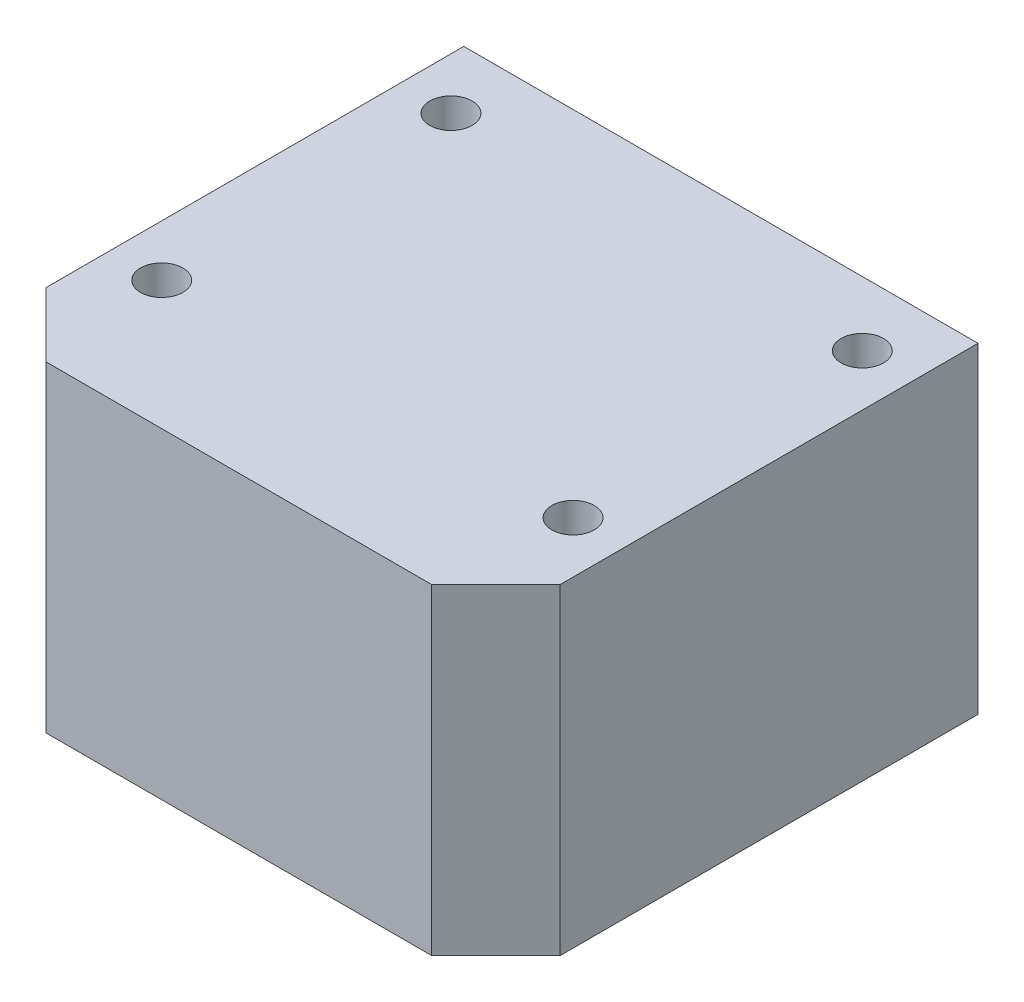
ISO-10303-21;
HEADER;
FILE_DESCRIPTION(('STEP AP214'),'2;1');
FILE_NAME('part.step','',(''),(''),'','','');
FILE_SCHEMA(('AUTOMOTIVE_DESIGN { 1 0 10303 214 1 1 1 1 }'));
ENDSEC;
DATA;
#1=APPLICATION_CONTEXT('core data for automotive mechanical design processes');
#2=APPLICATION_PROTOCOL_DEFINITION('international standard','automotive_design',2000,#1);
#3=PRODUCT_CONTEXT('',#1,'mechanical');
#4=PRODUCT('Part','Part','',(#3));
#5=PRODUCT_RELATED_PRODUCT_CATEGORY('part','',(#4));
#6=PRODUCT_DEFINITION_FORMATION('','',#4);
#7=PRODUCT_DEFINITION_CONTEXT('part definition',#1,'design');
#8=PRODUCT_DEFINITION('design','',#6,#7);
#9=PRODUCT_DEFINITION_SHAPE('','',#8);
#10=(LENGTH_UNIT() NAMED_UNIT(*) SI_UNIT(.MILLI.,.METRE.));
#11=(NAMED_UNIT(*) PLANE_ANGLE_UNIT() SI_UNIT($,.RADIAN.));
#12=(NAMED_UNIT(*) SI_UNIT($,.STERADIAN.) SOLID_ANGLE_UNIT());
#13=UNCERTAINTY_MEASURE_WITH_UNIT(LENGTH_MEASURE(1.E-05),#10,'distance_accuracy_value','');
#14=(GEOMETRIC_REPRESENTATION_CONTEXT(3) GLOBAL_UNCERTAINTY_ASSIGNED_CONTEXT((#13)) GLOBAL_UNIT_ASSIGNED_CONTEXT((#10,
#11,#12)) REPRESENTATION_CONTEXT('',''));
#15=CARTESIAN_POINT('',(0.,0.,0.));
#16=DIRECTION('',(0.,0.,1.));
#17=DIRECTION('',(1.,0.,0.));
#18=AXIS2_PLACEMENT_3D('',#15,#16,#17);
#19=CARTESIAN_POINT('',(-20.,25.,12.5));
#20=DIRECTION('',(1.,0.,0.));
#21=DIRECTION('',(0.,0.,-1.));
#22=AXIS2_PLACEMENT_3D('',#19,#20,#21);
#23=PLANE('',#22);
#24=DIRECTION('',(0.,0.,1.));
#25=VECTOR('',#24,1.);
#26=CARTESIAN_POINT('',(-20.,0.,12.5));
#27=LINE('',#26,#25);
#28=CARTESIAN_POINT('',(-20.,0.,-20.));
#29=VERTEX_POINT('',#28);
#30=CARTESIAN_POINT('',(-20.,0.,12.5));
#31=VERTEX_POINT('',#30);
#32=EDGE_CURVE('E180',#29,#31,#27,.T.);
#33=ORIENTED_EDGE('',*,*,#32,.T.);
#34=DIRECTION('',(0.,1.,0.));
#35=VECTOR('',#34,1.);
#36=CARTESIAN_POINT('',(-20.,25.,12.5));
#37=LINE('',#36,#35);
#38=CARTESIAN_POINT('',(-20.,25.,12.5));
#39=VERTEX_POINT('',#38);
#40=EDGE_CURVE('E11',#31,#39,#37,.T.);
#41=ORIENTED_EDGE('',*,*,#40,.T.);
#42=DIRECTION('',(0.,0.,1.));
#43=VECTOR('',#42,1.);
#44=CARTESIAN_POINT('',(-20.,25.,12.5));
#45=LINE('',#44,#43);
#46=CARTESIAN_POINT('',(-20.,25.,-20.));
#47=VERTEX_POINT('',#46);
#48=EDGE_CURVE('E181',#47,#39,#45,.T.);
#49=ORIENTED_EDGE('',*,*,#48,.F.);
#50=DIRECTION('',(0.,-1.,0.));
#51=VECTOR('',#50,1.);
#52=CARTESIAN_POINT('',(-20.,25.,-20.));
#53=LINE('',#52,#51);
#54=EDGE_CURVE('E191',#47,#29,#53,.T.);
#55=ORIENTED_EDGE('',*,*,#54,.T.);
#56=EDGE_LOOP('',(#33,#41,#49,#55));
#57=FACE_BOUND('',#56,.T.);
#58=ADVANCED_FACE('F51',(#57),#23,.F.);
#59=CARTESIAN_POINT('',(20.,25.,12.5));
#60=DIRECTION('',(-1.,0.,0.));
#61=DIRECTION('',(0.,0.,1.));
#62=AXIS2_PLACEMENT_3D('',#59,#60,#61);
#63=PLANE('',#62);
#64=DIRECTION('',(0.,0.,-1.));
#65=VECTOR('',#64,1.);
#66=CARTESIAN_POINT('',(20.,25.,12.5));
#67=LINE('',#66,#65);
#68=CARTESIAN_POINT('',(20.,25.,12.5));
#69=VERTEX_POINT('',#68);
#70=CARTESIAN_POINT('',(20.,25.,-20.));
#71=VERTEX_POINT('',#70);
#72=EDGE_CURVE('E184',#69,#71,#67,.T.);
#73=ORIENTED_EDGE('',*,*,#72,.F.);
#74=DIRECTION('',(0.,-1.,0.));
#75=VECTOR('',#74,1.);
#76=CARTESIAN_POINT('',(20.,0.,12.5));
#77=LINE('',#76,#75);
#78=CARTESIAN_POINT('',(20.,0.,12.5));
#79=VERTEX_POINT('',#78);
#80=EDGE_CURVE('E214',#69,#79,#77,.T.);
#81=ORIENTED_EDGE('',*,*,#80,.T.);
#82=DIRECTION('',(0.,0.,-1.));
#83=VECTOR('',#82,1.);
#84=CARTESIAN_POINT('',(20.,0.,12.5));
#85=LINE('',#84,#83);
#86=CARTESIAN_POINT('',(20.,0.,-20.));
#87=VERTEX_POINT('',#86);
#88=EDGE_CURVE('E194',#79,#87,#85,.T.);
#89=ORIENTED_EDGE('',*,*,#88,.T.);
#90=DIRECTION('',(0.,-1.,0.));
#91=VECTOR('',#90,1.);
#92=CARTESIAN_POINT('',(20.,25.,-20.));
#93=LINE('',#92,#91);
#94=EDGE_CURVE('E202',#71,#87,#93,.T.);
#95=ORIENTED_EDGE('',*,*,#94,.F.);
#96=EDGE_LOOP('',(#73,#81,#89,#95));
#97=FACE_BOUND('',#96,.T.);
#98=ADVANCED_FACE('F241',(#97),#63,.F.);
#99=CARTESIAN_POINT('',(20.,25.,-20.));
#100=DIRECTION('',(0.,0.,1.));
#101=DIRECTION('',(1.,0.,0.));
#102=AXIS2_PLACEMENT_3D('',#99,#100,#101);
#103=PLANE('',#102);
#104=CARTESIAN_POINT('',(0.,17.,-20.));
#105=DIRECTION('',(0.,0.,-1.));
#106=DIRECTION('',(-1.,0.,0.));
#107=AXIS2_PLACEMENT_3D('',#104,#105,#106);
#108=CIRCLE('',#107,1.64999999999999);
#109=CARTESIAN_POINT('',(-1.64999999999999,17.,-20.));
#110=VERTEX_POINT('',#109);
#111=EDGE_CURVE('E161',#110,#110,#108,.T.);
#112=ORIENTED_EDGE('',*,*,#111,.F.);
#113=EDGE_LOOP('',(#112));
#114=FACE_BOUND('',#113,.T.);
#115=DIRECTION('',(-1.,0.,0.));
#116=VECTOR('',#115,1.);
#117=CARTESIAN_POINT('',(20.,0.,-20.));
#118=LINE('',#117,#116);
#119=EDGE_CURVE('E185',#87,#29,#118,.T.);
#120=ORIENTED_EDGE('',*,*,#119,.T.);
#121=ORIENTED_EDGE('',*,*,#54,.F.);
#122=DIRECTION('',(-1.,0.,0.));
#123=VECTOR('',#122,1.);
#124=CARTESIAN_POINT('',(20.,25.,-20.));
#125=LINE('',#124,#123);
#126=EDGE_CURVE('E188',#71,#47,#125,.T.);
#127=ORIENTED_EDGE('',*,*,#126,.F.);
#128=ORIENTED_EDGE('',*,*,#94,.T.);
#129=EDGE_LOOP('',(#120,#121,#127,#128));
#130=FACE_BOUND('',#129,.T.);
#131=ADVANCED_FACE('F256',(#114,#130),#103,.F.);
#132=CARTESIAN_POINT('',(0.,25.,0.));
#133=DIRECTION('',(0.,1.,0.));
#134=DIRECTION('',(0.,0.,1.));
#135=AXIS2_PLACEMENT_3D('',#132,#133,#134);
#136=PLANE('',#135);
#137=CARTESIAN_POINT('',(-16.,25.,-15.));
#138=DIRECTION('',(0.,1.,0.));
#139=DIRECTION('',(0.,0.,1.));
#140=AXIS2_PLACEMENT_3D('',#137,#138,#139);
#141=CIRCLE('',#140,1.64999999999999);
#142=CARTESIAN_POINT('',(-16.,25.,-13.35));
#143=VERTEX_POINT('',#142);
#144=EDGE_CURVE('E132',#143,#143,#141,.T.);
#145=ORIENTED_EDGE('',*,*,#144,.F.);
#146=EDGE_LOOP('',(#145));
#147=FACE_BOUND('',#146,.T.);
#148=CARTESIAN_POINT('',(-16.,25.,7.5));
#149=DIRECTION('',(0.,1.,0.));
#150=DIRECTION('',(0.,0.,1.));
#151=AXIS2_PLACEMENT_3D('',#148,#149,#150);
#152=CIRCLE('',#151,1.64999999999999);
#153=CARTESIAN_POINT('',(-16.,25.,9.14999999999999));
#154=VERTEX_POINT('',#153);
#155=EDGE_CURVE('E131',#154,#154,#152,.T.);
#156=ORIENTED_EDGE('',*,*,#155,.F.);
#157=EDGE_LOOP('',(#156));
#158=FACE_BOUND('',#157,.T.);
#159=CARTESIAN_POINT('',(16.,25.,7.5));
#160=DIRECTION('',(0.,1.,0.));
#161=DIRECTION('',(0.,0.,1.));
#162=AXIS2_PLACEMENT_3D('',#159,#160,#161);
#163=CIRCLE('',#162,1.64999999999999);
#164=CARTESIAN_POINT('',(16.,25.,9.14999999999999));
#165=VERTEX_POINT('',#164);
#166=EDGE_CURVE('E145',#165,#165,#163,.T.);
#167=ORIENTED_EDGE('',*,*,#166,.F.);
#168=EDGE_LOOP('',(#167));
#169=FACE_BOUND('',#168,.T.);
#170=CARTESIAN_POINT('',(16.,25.,-15.));
#171=DIRECTION('',(0.,1.,0.));
#172=DIRECTION('',(0.,0.,1.));
#173=AXIS2_PLACEMENT_3D('',#170,#171,#172);
#174=CIRCLE('',#173,1.64999999999999);
#175=CARTESIAN_POINT('',(16.,25.,-13.35));
#176=VERTEX_POINT('',#175);
#177=EDGE_CURVE('E153',#176,#176,#174,.T.);
#178=ORIENTED_EDGE('',*,*,#177,.F.);
#179=EDGE_LOOP('',(#178));
#180=FACE_BOUND('',#179,.T.);
#181=DIRECTION('',(-1.,0.,0.));
#182=VECTOR('',#181,1.);
#183=CARTESIAN_POINT('',(-20.,25.,17.5));
#184=LINE('',#183,#182);
#185=CARTESIAN_POINT('',(15.,25.,17.5));
#186=VERTEX_POINT('',#185);
#187=CARTESIAN_POINT('',(-15.,25.,17.5));
#188=VERTEX_POINT('',#187);
#189=EDGE_CURVE('E177',#186,#188,#184,.T.);
#190=ORIENTED_EDGE('',*,*,#189,.F.);
#191=DIRECTION('',(0.707106781186549,0.,-0.707106781186547));
#192=VECTOR('',#191,1.);
#193=CARTESIAN_POINT('',(16.25,25.,16.25));
#194=LINE('',#193,#192);
#195=EDGE_CURVE('E61',#186,#69,#194,.T.);
#196=ORIENTED_EDGE('',*,*,#195,.T.);
#197=ORIENTED_EDGE('',*,*,#72,.T.);
#198=ORIENTED_EDGE('',*,*,#126,.T.);
#199=ORIENTED_EDGE('',*,*,#48,.T.);
#200=DIRECTION('',(0.707106781186546,0.,0.707106781186549));
#201=VECTOR('',#200,1.);
#202=CARTESIAN_POINT('',(-16.25,25.,16.25));
#203=LINE('',#202,#201);
#204=EDGE_CURVE('E73',#39,#188,#203,.T.);
#205=ORIENTED_EDGE('',*,*,#204,.T.);
#206=EDGE_LOOP('',(#190,#196,#197,#198,#199,#205));
#207=FACE_BOUND('',#206,.T.);
#208=ADVANCED_FACE('F235',(#147,#158,#169,#180,#207),#136,.T.);
#209=CARTESIAN_POINT('',(0.,0.,0.));
#210=DIRECTION('',(0.,1.,0.));
#211=DIRECTION('',(0.,0.,1.));
#212=AXIS2_PLACEMENT_3D('',#209,#210,#211);
#213=PLANE('',#212);
#214=CARTESIAN_POINT('',(0.,0.,0.));
#215=DIRECTION('',(0.,1.,0.));
#216=DIRECTION('',(0.,0.,1.));
#217=AXIS2_PLACEMENT_3D('',#214,#215,#216);
#218=CIRCLE('',#217,15.);
#219=CARTESIAN_POINT('',(0.,0.,15.));
#220=VERTEX_POINT('',#219);
#221=EDGE_CURVE('E206',#220,#220,#218,.T.);
#222=ORIENTED_EDGE('',*,*,#221,.T.);
#223=EDGE_LOOP('',(#222));
#224=FACE_BOUND('',#223,.T.);
#225=ORIENTED_EDGE('',*,*,#88,.F.);
#226=DIRECTION('',(-0.707106781186549,0.,0.707106781186547));
#227=VECTOR('',#226,1.);
#228=CARTESIAN_POINT('',(20.,0.,12.5));
#229=LINE('',#228,#227);
#230=CARTESIAN_POINT('',(15.,0.,17.5));
#231=VERTEX_POINT('',#230);
#232=EDGE_CURVE('E221',#79,#231,#229,.T.);
#233=ORIENTED_EDGE('',*,*,#232,.T.);
#234=DIRECTION('',(-1.,0.,0.));
#235=VECTOR('',#234,1.);
#236=CARTESIAN_POINT('',(-20.,0.,17.5));
#237=LINE('',#236,#235);
#238=CARTESIAN_POINT('',(-15.,0.,17.5));
#239=VERTEX_POINT('',#238);
#240=EDGE_CURVE('E173',#231,#239,#237,.T.);
#241=ORIENTED_EDGE('',*,*,#240,.T.);
#242=DIRECTION('',(-0.707106781186546,0.,-0.707106781186549));
#243=VECTOR('',#242,1.);
#244=CARTESIAN_POINT('',(-15.,0.,17.5));
#245=LINE('',#244,#243);
#246=EDGE_CURVE('E218',#239,#31,#245,.T.);
#247=ORIENTED_EDGE('',*,*,#246,.T.);
#248=ORIENTED_EDGE('',*,*,#32,.F.);
#249=ORIENTED_EDGE('',*,*,#119,.F.);
#250=EDGE_LOOP('',(#225,#233,#241,#247,#248,#249));
#251=FACE_BOUND('',#250,.T.);
#252=ADVANCED_FACE('F247',(#224,#251),#213,.F.);
#253=CARTESIAN_POINT('',(-20.,65.3112887414927,17.5));
#254=DIRECTION('',(0.,0.,1.));
#255=DIRECTION('',(1.,0.,0.));
#256=AXIS2_PLACEMENT_3D('',#253,#254,#255);
#257=PLANE('',#256);
#258=ORIENTED_EDGE('',*,*,#240,.F.);
#259=DIRECTION('',(0.,1.,0.));
#260=VECTOR('',#259,1.);
#261=CARTESIAN_POINT('',(15.,25.,17.5));
#262=LINE('',#261,#260);
#263=EDGE_CURVE('E228',#231,#186,#262,.T.);
#264=ORIENTED_EDGE('',*,*,#263,.T.);
#265=ORIENTED_EDGE('',*,*,#189,.T.);
#266=DIRECTION('',(0.,-1.,0.));
#267=VECTOR('',#266,1.);
#268=CARTESIAN_POINT('',(-15.,0.,17.5));
#269=LINE('',#268,#267);
#270=EDGE_CURVE('E224',#188,#239,#269,.T.);
#271=ORIENTED_EDGE('',*,*,#270,.T.);
#272=EDGE_LOOP('',(#258,#264,#265,#271));
#273=FACE_BOUND('',#272,.T.);
#274=ADVANCED_FACE('F250',(#273),#257,.T.);
#275=CARTESIAN_POINT('',(0.,9.,0.));
#276=DIRECTION('',(0.,-1.,0.));
#277=DIRECTION('',(0.,0.,-1.));
#278=AXIS2_PLACEMENT_3D('',#275,#276,#277);
#279=CYLINDRICAL_SURFACE('',#278,14.);
#280=CARTESIAN_POINT('',(0.,1.00000000000001,0.));
#281=DIRECTION('',(0.,1.,0.));
#282=DIRECTION('',(0.,0.,1.));
#283=AXIS2_PLACEMENT_3D('',#280,#281,#282);
#284=CIRCLE('',#283,14.);
#285=CARTESIAN_POINT('',(0.,1.00000000000001,14.));
#286=VERTEX_POINT('',#285);
#287=EDGE_CURVE('E210',#286,#286,#284,.F.);
#288=ORIENTED_EDGE('',*,*,#287,.T.);
#289=EDGE_LOOP('',(#288));
#290=FACE_BOUND('',#289,.T.);
#291=CARTESIAN_POINT('',(0.,9.,0.));
#292=DIRECTION('',(0.,1.,0.));
#293=DIRECTION('',(0.,0.,1.));
#294=AXIS2_PLACEMENT_3D('',#291,#292,#293);
#295=CIRCLE('',#294,14.);
#296=CARTESIAN_POINT('',(0.,9.,14.));
#297=VERTEX_POINT('',#296);
#298=EDGE_CURVE('E169',#297,#297,#295,.T.);
#299=ORIENTED_EDGE('',*,*,#298,.T.);
#300=EDGE_LOOP('',(#299));
#301=FACE_BOUND('',#300,.T.);
#302=ADVANCED_FACE('F306',(#290,#301),#279,.F.);
#303=CARTESIAN_POINT('',(0.,9.,0.));
#304=DIRECTION('',(0.,1.,0.));
#305=DIRECTION('',(0.,0.,1.));
#306=AXIS2_PLACEMENT_3D('',#303,#304,#305);
#307=PLANE('',#306);
#308=ORIENTED_EDGE('',*,*,#298,.F.);
#309=EDGE_LOOP('',(#308));
#310=FACE_BOUND('',#309,.T.);
#311=ADVANCED_FACE('F281',(#310),#307,.F.);
#312=CARTESIAN_POINT('',(0.,0.,0.));
#313=DIRECTION('',(0.,-1.,0.));
#314=DIRECTION('',(0.,0.,-1.));
#315=AXIS2_PLACEMENT_3D('',#312,#313,#314);
#316=CONICAL_SURFACE('',#315,15.,0.78539816339745);
#317=ORIENTED_EDGE('',*,*,#287,.F.);
#318=EDGE_LOOP('',(#317));
#319=FACE_BOUND('',#318,.T.);
#320=ORIENTED_EDGE('',*,*,#221,.F.);
#321=EDGE_LOOP('',(#320));
#322=FACE_BOUND('',#321,.T.);
#323=ADVANCED_FACE('F275',(#319,#322),#316,.F.);
#324=CARTESIAN_POINT('',(0.,17.,-10.));
#325=DIRECTION('',(0.,0.,-1.));
#326=DIRECTION('',(-1.,0.,0.));
#327=AXIS2_PLACEMENT_3D('',#324,#325,#326);
#328=CONICAL_SURFACE('',#327,1.65,1.02974425867665);
#329=CARTESIAN_POINT('',(0.,17.,-9.00857997860453));
#330=VERTEX_POINT('',#329);
#331=VERTEX_LOOP('',#330);
#332=FACE_BOUND('',#331,.T.);
#333=CARTESIAN_POINT('',(0.,17.,-10.));
#334=DIRECTION('',(0.,0.,-1.));
#335=DIRECTION('',(-1.,0.,0.));
#336=AXIS2_PLACEMENT_3D('',#333,#334,#335);
#337=CIRCLE('',#336,1.65);
#338=CARTESIAN_POINT('',(-1.65,17.,-10.));
#339=VERTEX_POINT('',#338);
#340=EDGE_CURVE('E165',#339,#339,#337,.T.);
#341=ORIENTED_EDGE('',*,*,#340,.T.);
#342=EDGE_LOOP('',(#341));
#343=FACE_BOUND('',#342,.T.);
#344=ADVANCED_FACE('F280',(#332,#343),#328,.F.);
#345=CARTESIAN_POINT('',(0.,17.,-20.));
#346=DIRECTION('',(0.,0.,-1.));
#347=DIRECTION('',(-1.,0.,0.));
#348=AXIS2_PLACEMENT_3D('',#345,#346,#347);
#349=CYLINDRICAL_SURFACE('',#348,1.64999999999999);
#350=ORIENTED_EDGE('',*,*,#340,.F.);
#351=EDGE_LOOP('',(#350));
#352=FACE_BOUND('',#351,.T.);
#353=ORIENTED_EDGE('',*,*,#111,.T.);
#354=EDGE_LOOP('',(#353));
#355=FACE_BOUND('',#354,.T.);
#356=ADVANCED_FACE('F286',(#352,#355),#349,.F.);
#357=CARTESIAN_POINT('',(20.,25.,12.5));
#358=DIRECTION('',(0.707106781186546,0.,0.707106781186548));
#359=DIRECTION('',(0.,1.,0.));
#360=AXIS2_PLACEMENT_3D('',#357,#358,#359);
#361=PLANE('',#360);
#362=ORIENTED_EDGE('',*,*,#195,.F.);
#363=ORIENTED_EDGE('',*,*,#263,.F.);
#364=ORIENTED_EDGE('',*,*,#232,.F.);
#365=ORIENTED_EDGE('',*,*,#80,.F.);
#366=EDGE_LOOP('',(#362,#363,#364,#365));
#367=FACE_BOUND('',#366,.T.);
#368=ADVANCED_FACE('F244',(#367),#361,.T.);
#369=CARTESIAN_POINT('',(-15.,65.3112887414927,17.5));
#370=DIRECTION('',(-0.707106781186549,0.,0.707106781186546));
#371=DIRECTION('',(0.,1.,0.));
#372=AXIS2_PLACEMENT_3D('',#369,#370,#371);
#373=PLANE('',#372);
#374=ORIENTED_EDGE('',*,*,#204,.F.);
#375=ORIENTED_EDGE('',*,*,#40,.F.);
#376=ORIENTED_EDGE('',*,*,#246,.F.);
#377=ORIENTED_EDGE('',*,*,#270,.F.);
#378=EDGE_LOOP('',(#374,#375,#376,#377));
#379=FACE_BOUND('',#378,.T.);
#380=ADVANCED_FACE('F54',(#379),#373,.T.);
#381=CARTESIAN_POINT('',(16.,12.9,-15.));
#382=DIRECTION('',(0.,1.,0.));
#383=DIRECTION('',(0.,0.,1.));
#384=AXIS2_PLACEMENT_3D('',#381,#382,#383);
#385=CONICAL_SURFACE('',#384,1.65,1.02974425867665);
#386=CARTESIAN_POINT('',(16.,11.9085799786045,-15.));
#387=VERTEX_POINT('',#386);
#388=VERTEX_LOOP('',#387);
#389=FACE_BOUND('',#388,.T.);
#390=CARTESIAN_POINT('',(16.,12.9,-15.));
#391=DIRECTION('',(0.,1.,0.));
#392=DIRECTION('',(0.,0.,1.));
#393=AXIS2_PLACEMENT_3D('',#390,#391,#392);
#394=CIRCLE('',#393,1.65);
#395=CARTESIAN_POINT('',(16.,12.9,-13.35));
#396=VERTEX_POINT('',#395);
#397=EDGE_CURVE('E157',#396,#396,#394,.T.);
#398=ORIENTED_EDGE('',*,*,#397,.T.);
#399=EDGE_LOOP('',(#398));
#400=FACE_BOUND('',#399,.T.);
#401=ADVANCED_FACE('F291',(#389,#400),#385,.F.);
#402=CARTESIAN_POINT('',(16.,25.,-15.));
#403=DIRECTION('',(0.,1.,0.));
#404=DIRECTION('',(0.,0.,1.));
#405=AXIS2_PLACEMENT_3D('',#402,#403,#404);
#406=CYLINDRICAL_SURFACE('',#405,1.65);
#407=ORIENTED_EDGE('',*,*,#397,.F.);
#408=EDGE_LOOP('',(#407));
#409=FACE_BOUND('',#408,.T.);
#410=ORIENTED_EDGE('',*,*,#177,.T.);
#411=EDGE_LOOP('',(#410));
#412=FACE_BOUND('',#411,.T.);
#413=ADVANCED_FACE('F425',(#409,#412),#406,.F.);
#414=CARTESIAN_POINT('',(16.,12.9,7.5));
#415=DIRECTION('',(0.,1.,0.));
#416=DIRECTION('',(0.,0.,1.));
#417=AXIS2_PLACEMENT_3D('',#414,#415,#416);
#418=CONICAL_SURFACE('',#417,1.65,1.02974425867665);
#419=CARTESIAN_POINT('',(16.,11.9085799786045,7.5));
#420=VERTEX_POINT('',#419);
#421=VERTEX_LOOP('',#420);
#422=FACE_BOUND('',#421,.T.);
#423=CARTESIAN_POINT('',(16.,12.9,7.5));
#424=DIRECTION('',(0.,1.,0.));
#425=DIRECTION('',(0.,0.,1.));
#426=AXIS2_PLACEMENT_3D('',#423,#424,#425);
#427=CIRCLE('',#426,1.65);
#428=CARTESIAN_POINT('',(16.,12.9,9.15));
#429=VERTEX_POINT('',#428);
#430=EDGE_CURVE('E149',#429,#429,#427,.T.);
#431=ORIENTED_EDGE('',*,*,#430,.T.);
#432=EDGE_LOOP('',(#431));
#433=FACE_BOUND('',#432,.T.);
#434=ADVANCED_FACE('F433',(#422,#433),#418,.F.);
#435=CARTESIAN_POINT('',(16.,25.,7.5));
#436=DIRECTION('',(0.,1.,0.));
#437=DIRECTION('',(0.,0.,1.));
#438=AXIS2_PLACEMENT_3D('',#435,#436,#437);
#439=CYLINDRICAL_SURFACE('',#438,1.65);
#440=ORIENTED_EDGE('',*,*,#430,.F.);
#441=EDGE_LOOP('',(#440));
#442=FACE_BOUND('',#441,.T.);
#443=ORIENTED_EDGE('',*,*,#166,.T.);
#444=EDGE_LOOP('',(#443));
#445=FACE_BOUND('',#444,.T.);
#446=ADVANCED_FACE('F442',(#442,#445),#439,.F.);
#447=CARTESIAN_POINT('',(-16.,12.9,7.5));
#448=DIRECTION('',(0.,1.,0.));
#449=DIRECTION('',(0.,0.,1.));
#450=AXIS2_PLACEMENT_3D('',#447,#448,#449);
#451=CONICAL_SURFACE('',#450,1.65,1.02974425867665);
#452=CARTESIAN_POINT('',(-16.,11.9085799786045,7.5));
#453=VERTEX_POINT('',#452);
#454=VERTEX_LOOP('',#453);
#455=FACE_BOUND('',#454,.T.);
#456=CARTESIAN_POINT('',(-16.,12.9,7.5));
#457=DIRECTION('',(0.,1.,0.));
#458=DIRECTION('',(0.,0.,1.));
#459=AXIS2_PLACEMENT_3D('',#456,#457,#458);
#460=CIRCLE('',#459,1.65);
#461=CARTESIAN_POINT('',(-16.,12.9,9.15));
#462=VERTEX_POINT('',#461);
#463=EDGE_CURVE('E137',#462,#462,#460,.T.);
#464=ORIENTED_EDGE('',*,*,#463,.T.);
#465=EDGE_LOOP('',(#464));
#466=FACE_BOUND('',#465,.T.);
#467=ADVANCED_FACE('F452',(#455,#466),#451,.F.);
#468=CARTESIAN_POINT('',(-16.,25.,7.5));
#469=DIRECTION('',(0.,1.,0.));
#470=DIRECTION('',(0.,0.,1.));
#471=AXIS2_PLACEMENT_3D('',#468,#469,#470);
#472=CYLINDRICAL_SURFACE('',#471,1.64999999999999);
#473=ORIENTED_EDGE('',*,*,#463,.F.);
#474=EDGE_LOOP('',(#473));
#475=FACE_BOUND('',#474,.T.);
#476=ORIENTED_EDGE('',*,*,#155,.T.);
#477=EDGE_LOOP('',(#476));
#478=FACE_BOUND('',#477,.T.);
#479=ADVANCED_FACE('F124',(#475,#478),#472,.F.);
#480=CARTESIAN_POINT('',(-16.,12.9,-15.));
#481=DIRECTION('',(0.,1.,0.));
#482=DIRECTION('',(0.,0.,1.));
#483=AXIS2_PLACEMENT_3D('',#480,#481,#482);
#484=CONICAL_SURFACE('',#483,1.65,1.02974425867665);
#485=CARTESIAN_POINT('',(-16.,11.9085799786045,-15.));
#486=VERTEX_POINT('',#485);
#487=VERTEX_LOOP('',#486);
#488=FACE_BOUND('',#487,.T.);
#489=CARTESIAN_POINT('',(-16.,12.9,-15.));
#490=DIRECTION('',(0.,1.,0.));
#491=DIRECTION('',(0.,0.,1.));
#492=AXIS2_PLACEMENT_3D('',#489,#490,#491);
#493=CIRCLE('',#492,1.65);
#494=CARTESIAN_POINT('',(-16.,12.9,-13.35));
#495=VERTEX_POINT('',#494);
#496=EDGE_CURVE('E128',#495,#495,#493,.T.);
#497=ORIENTED_EDGE('',*,*,#496,.T.);
#498=EDGE_LOOP('',(#497));
#499=FACE_BOUND('',#498,.T.);
#500=ADVANCED_FACE('F120',(#488,#499),#484,.F.);
#501=CARTESIAN_POINT('',(-16.,25.,-15.));
#502=DIRECTION('',(0.,1.,0.));
#503=DIRECTION('',(0.,0.,1.));
#504=AXIS2_PLACEMENT_3D('',#501,#502,#503);
#505=CYLINDRICAL_SURFACE('',#504,1.64999999999999);
#506=ORIENTED_EDGE('',*,*,#496,.F.);
#507=EDGE_LOOP('',(#506));
#508=FACE_BOUND('',#507,.T.);
#509=ORIENTED_EDGE('',*,*,#144,.T.);
#510=EDGE_LOOP('',(#509));
#511=FACE_BOUND('',#510,.T.);
#512=ADVANCED_FACE('F123',(#508,#511),#505,.F.);
#513=CLOSED_SHELL('',(#58,#98,#131,#208,#252,#274,#302,#311,#323,#344,#356,#368,#380,#401,#413,
#434,#446,#467,#479,#500,#512));
#514=MANIFOLD_SOLID_BREP('B2',#513);
#515=ADVANCED_BREP_SHAPE_REPRESENTATION('',(#18,#514),#14);
#516=SHAPE_DEFINITION_REPRESENTATION(#9,#515);
ENDSEC;
END-ISO-10303-21;
